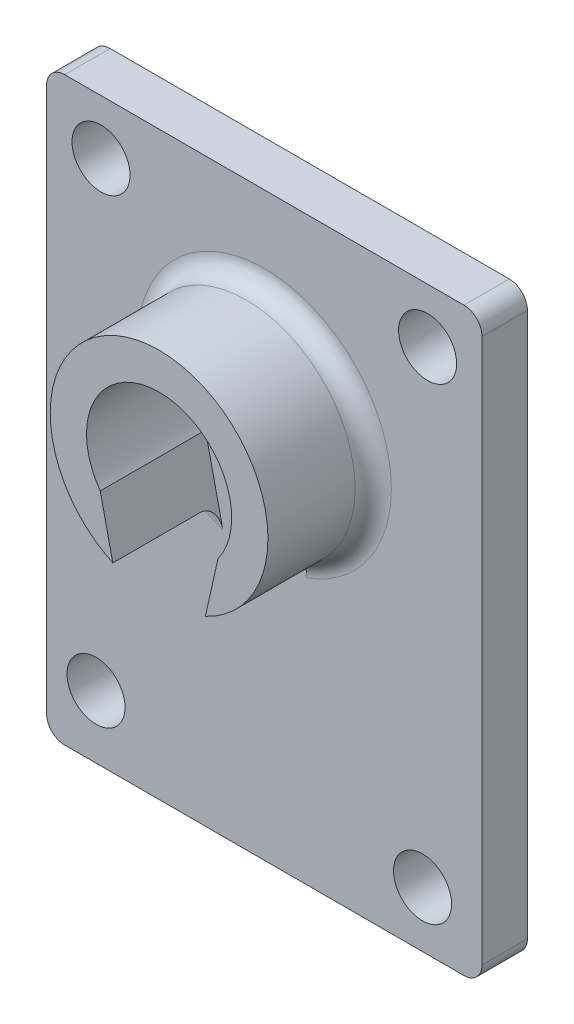
ISO-10303-21;
HEADER;
FILE_DESCRIPTION(('STEP AP214'),'2;1');
FILE_NAME('part.step','',(''),(''),'','','');
FILE_SCHEMA(('AUTOMOTIVE_DESIGN { 1 0 10303 214 1 1 1 1 }'));
ENDSEC;
DATA;
#1=APPLICATION_CONTEXT('core data for automotive mechanical design processes');
#2=APPLICATION_PROTOCOL_DEFINITION('international standard','automotive_design',2000,#1);
#3=PRODUCT_CONTEXT('',#1,'mechanical');
#4=PRODUCT('Part','Part','',(#3));
#5=PRODUCT_RELATED_PRODUCT_CATEGORY('part','',(#4));
#6=PRODUCT_DEFINITION_FORMATION('','',#4);
#7=PRODUCT_DEFINITION_CONTEXT('part definition',#1,'design');
#8=PRODUCT_DEFINITION('design','',#6,#7);
#9=PRODUCT_DEFINITION_SHAPE('','',#8);
#10=(LENGTH_UNIT() NAMED_UNIT(*) SI_UNIT(.MILLI.,.METRE.));
#11=(NAMED_UNIT(*) PLANE_ANGLE_UNIT() SI_UNIT($,.RADIAN.));
#12=(NAMED_UNIT(*) SI_UNIT($,.STERADIAN.) SOLID_ANGLE_UNIT());
#13=UNCERTAINTY_MEASURE_WITH_UNIT(LENGTH_MEASURE(1.E-05),#10,'distance_accuracy_value','');
#14=(GEOMETRIC_REPRESENTATION_CONTEXT(3) GLOBAL_UNCERTAINTY_ASSIGNED_CONTEXT((#13)) GLOBAL_UNIT_ASSIGNED_CONTEXT((#10,
#11,#12)) REPRESENTATION_CONTEXT('',''));
#15=CARTESIAN_POINT('',(0.,0.,0.));
#16=DIRECTION('',(0.,0.,1.));
#17=DIRECTION('',(1.,0.,0.));
#18=AXIS2_PLACEMENT_3D('',#15,#16,#17);
#19=CARTESIAN_POINT('',(10.5977749083218,0.272435897435896,8.3));
#20=DIRECTION('',(0.,0.,-1.));
#21=DIRECTION('',(-1.,0.,0.));
#22=AXIS2_PLACEMENT_3D('',#19,#20,#21);
#23=CYLINDRICAL_SURFACE('',#22,4.);
#24=CARTESIAN_POINT('',(10.5977749083218,0.272435897435896,8.3));
#25=DIRECTION('',(0.,0.,1.));
#26=DIRECTION('',(1.,0.,0.));
#27=AXIS2_PLACEMENT_3D('',#24,#25,#26);
#28=CIRCLE('',#27,4.);
#29=CARTESIAN_POINT('',(13.8414398693809,-2.06821307675854,8.3));
#30=VERTEX_POINT('',#29);
#31=CARTESIAN_POINT('',(7.35410994726267,-2.06821307675853,8.3));
#32=VERTEX_POINT('',#31);
#33=EDGE_CURVE('E150',#30,#32,#28,.T.);
#34=ORIENTED_EDGE('',*,*,#33,.T.);
#35=DIRECTION('',(0.,0.,1.));
#36=VECTOR('',#35,1.);
#37=CARTESIAN_POINT('',(7.35410994726267,-2.06821307675853,2.5));
#38=LINE('',#37,#36);
#39=CARTESIAN_POINT('',(7.35410994726267,-2.06821307675853,2.5));
#40=VERTEX_POINT('',#39);
#41=EDGE_CURVE('E134',#40,#32,#38,.T.);
#42=ORIENTED_EDGE('',*,*,#41,.F.);
#43=CARTESIAN_POINT('',(10.5977749083218,0.272435897435896,2.5));
#44=DIRECTION('',(0.,0.,1.));
#45=DIRECTION('',(1.,0.,0.));
#46=AXIS2_PLACEMENT_3D('',#43,#44,#45);
#47=CIRCLE('',#46,4.);
#48=CARTESIAN_POINT('',(13.8414398693809,-2.06821307675854,2.5));
#49=VERTEX_POINT('',#48);
#50=EDGE_CURVE('E148',#49,#40,#47,.T.);
#51=ORIENTED_EDGE('',*,*,#50,.F.);
#52=DIRECTION('',(0.,0.,1.));
#53=VECTOR('',#52,1.);
#54=CARTESIAN_POINT('',(13.8414398693809,-2.06821307675854,2.5));
#55=LINE('',#54,#53);
#56=EDGE_CURVE('E363',#49,#30,#55,.T.);
#57=ORIENTED_EDGE('',*,*,#56,.T.);
#58=EDGE_LOOP('',(#34,#42,#51,#57));
#59=FACE_BOUND('',#58,.T.);
#60=ADVANCED_FACE('F36',(#59),#23,.F.);
#61=CARTESIAN_POINT('',(0.,0.,8.3));
#62=DIRECTION('',(0.,0.,1.));
#63=DIRECTION('',(1.,0.,0.));
#64=AXIS2_PLACEMENT_3D('',#61,#62,#63);
#65=PLANE('',#64);
#66=CARTESIAN_POINT('',(10.5977749083218,0.272435897435896,8.3));
#67=DIRECTION('',(0.,0.,1.));
#68=DIRECTION('',(1.,0.,0.));
#69=AXIS2_PLACEMENT_3D('',#66,#67,#68);
#70=CIRCLE('',#69,6.);
#71=CARTESIAN_POINT('',(13.1477749083218,-5.1587241996336,8.3));
#72=VERTEX_POINT('',#71);
#73=CARTESIAN_POINT('',(8.04777490832179,-5.15872419963361,8.3));
#74=VERTEX_POINT('',#73);
#75=EDGE_CURVE('E157',#72,#74,#70,.T.);
#76=ORIENTED_EDGE('',*,*,#75,.T.);
#77=DIRECTION('',(-0.219001296975217,0.975724567653789,0.));
#78=VECTOR('',#77,1.);
#79=CARTESIAN_POINT('',(6.55944930315858,1.47226784325946,8.3));
#80=LINE('',#79,#78);
#81=EDGE_CURVE('E142',#74,#32,#80,.T.);
#82=ORIENTED_EDGE('',*,*,#81,.T.);
#83=ORIENTED_EDGE('',*,*,#33,.F.);
#84=DIRECTION('',(0.219001296975215,0.975724567653789,0.));
#85=VECTOR('',#84,1.);
#86=CARTESIAN_POINT('',(13.6195287080283,-3.05690207065453,8.3));
#87=LINE('',#86,#85);
#88=EDGE_CURVE('E361',#72,#30,#87,.T.);
#89=ORIENTED_EDGE('',*,*,#88,.F.);
#90=EDGE_LOOP('',(#76,#82,#83,#89));
#91=FACE_BOUND('',#90,.T.);
#92=ADVANCED_FACE('F242',(#91),#65,.T.);
#93=CARTESIAN_POINT('',(0.,0.,2.5));
#94=DIRECTION('',(0.,0.,1.));
#95=DIRECTION('',(1.,0.,0.));
#96=AXIS2_PLACEMENT_3D('',#93,#94,#95);
#97=PLANE('',#96);
#98=DIRECTION('',(-0.219001296975217,0.975724567653789,0.));
#99=VECTOR('',#98,1.);
#100=CARTESIAN_POINT('',(6.55944930315858,1.47226784325946,2.5));
#101=LINE('',#100,#99);
#102=CARTESIAN_POINT('',(8.313925423832,-6.34451442217477,2.5));
#103=VERTEX_POINT('',#102);
#104=EDGE_CURVE('E131',#103,#40,#101,.T.);
#105=ORIENTED_EDGE('',*,*,#104,.F.);
#106=CARTESIAN_POINT('',(10.5977749083218,0.272435897435896,2.5));
#107=DIRECTION('',(0.,0.,1.));
#108=DIRECTION('',(1.,0.,0.));
#109=AXIS2_PLACEMENT_3D('',#106,#107,#108);
#110=CIRCLE('',#109,7.);
#111=CARTESIAN_POINT('',(12.8816243928116,-6.34451442217477,2.5));
#112=VERTEX_POINT('',#111);
#113=EDGE_CURVE('E214',#103,#112,#110,.F.);
#114=ORIENTED_EDGE('',*,*,#113,.T.);
#115=DIRECTION('',(0.219001296975215,0.975724567653789,0.));
#116=VECTOR('',#115,1.);
#117=CARTESIAN_POINT('',(13.6195287080283,-3.05690207065453,2.5));
#118=LINE('',#117,#116);
#119=EDGE_CURVE('E155',#112,#49,#118,.T.);
#120=ORIENTED_EDGE('',*,*,#119,.T.);
#121=ORIENTED_EDGE('',*,*,#50,.T.);
#122=EDGE_LOOP('',(#105,#114,#120,#121));
#123=FACE_BOUND('',#122,.T.);
#124=CARTESIAN_POINT('',(19.318040385481,-17.909823822338,2.5));
#125=DIRECTION('',(0.,0.,1.));
#126=DIRECTION('',(1.,0.,0.));
#127=AXIS2_PLACEMENT_3D('',#124,#125,#126);
#128=CIRCLE('',#127,1.59999999999999);
#129=CARTESIAN_POINT('',(20.918040385481,-17.909823822338,2.5));
#130=VERTEX_POINT('',#129);
#131=EDGE_CURVE('E173',#130,#130,#128,.T.);
#132=ORIENTED_EDGE('',*,*,#131,.F.);
#133=EDGE_LOOP('',(#132));
#134=FACE_BOUND('',#133,.T.);
#135=CARTESIAN_POINT('',(1.59777490832179,8.02243589743589,2.5));
#136=DIRECTION('',(0.,0.,1.));
#137=DIRECTION('',(1.,0.,0.));
#138=AXIS2_PLACEMENT_3D('',#135,#136,#137);
#139=CIRCLE('',#138,1.6);
#140=CARTESIAN_POINT('',(3.19777490832179,8.02243589743589,2.5));
#141=VERTEX_POINT('',#140);
#142=EDGE_CURVE('E185',#141,#141,#139,.T.);
#143=ORIENTED_EDGE('',*,*,#142,.F.);
#144=EDGE_LOOP('',(#143));
#145=FACE_BOUND('',#144,.T.);
#146=DIRECTION('',(-1.,0.,0.));
#147=VECTOR('',#146,1.);
#148=CARTESIAN_POINT('',(-1.40222509167821,11.0224358974359,2.5));
#149=LINE('',#148,#147);
#150=CARTESIAN_POINT('',(21.5977749083218,11.0224358974359,2.5));
#151=VERTEX_POINT('',#150);
#152=CARTESIAN_POINT('',(-0.402225091678214,11.0224358974359,2.5));
#153=VERTEX_POINT('',#152);
#154=EDGE_CURVE('E199',#151,#153,#149,.T.);
#155=ORIENTED_EDGE('',*,*,#154,.T.);
#156=CARTESIAN_POINT('',(-0.402225091678214,10.0224358974359,2.5));
#157=DIRECTION('',(0.,0.,1.));
#158=DIRECTION('',(1.,0.,0.));
#159=AXIS2_PLACEMENT_3D('',#156,#157,#158);
#160=CIRCLE('',#159,1.);
#161=CARTESIAN_POINT('',(-1.40222509167821,10.0224358974359,2.5));
#162=VERTEX_POINT('',#161);
#163=EDGE_CURVE('E300',#153,#162,#160,.T.);
#164=ORIENTED_EDGE('',*,*,#163,.T.);
#165=DIRECTION('',(0.,-1.,0.));
#166=VECTOR('',#165,1.);
#167=CARTESIAN_POINT('',(-1.40222509167821,11.0224358974359,2.5));
#168=LINE('',#167,#166);
#169=CARTESIAN_POINT('',(-1.40222509167821,-19.9775641025641,2.5));
#170=VERTEX_POINT('',#169);
#171=EDGE_CURVE('E191',#162,#170,#168,.T.);
#172=ORIENTED_EDGE('',*,*,#171,.T.);
#173=CARTESIAN_POINT('',(-0.40222509167821,-19.9775641025641,2.5));
#174=DIRECTION('',(0.,0.,1.));
#175=DIRECTION('',(1.,0.,0.));
#176=AXIS2_PLACEMENT_3D('',#173,#174,#175);
#177=CIRCLE('',#176,1.);
#178=CARTESIAN_POINT('',(-0.40222509167821,-20.9775641025641,2.5));
#179=VERTEX_POINT('',#178);
#180=EDGE_CURVE('E319',#170,#179,#177,.T.);
#181=ORIENTED_EDGE('',*,*,#180,.T.);
#182=DIRECTION('',(1.,0.,0.));
#183=VECTOR('',#182,1.);
#184=CARTESIAN_POINT('',(-1.40222509167821,-20.9775641025641,2.5));
#185=LINE('',#184,#183);
#186=CARTESIAN_POINT('',(21.5977749083218,-20.9775641025641,2.5));
#187=VERTEX_POINT('',#186);
#188=EDGE_CURVE('E194',#179,#187,#185,.T.);
#189=ORIENTED_EDGE('',*,*,#188,.T.);
#190=CARTESIAN_POINT('',(21.5977749083218,-19.9775641025641,2.5));
#191=DIRECTION('',(0.,0.,1.));
#192=DIRECTION('',(1.,0.,0.));
#193=AXIS2_PLACEMENT_3D('',#190,#191,#192);
#194=CIRCLE('',#193,1.);
#195=CARTESIAN_POINT('',(22.5977749083218,-19.9775641025641,2.5));
#196=VERTEX_POINT('',#195);
#197=EDGE_CURVE('E57',#187,#196,#194,.T.);
#198=ORIENTED_EDGE('',*,*,#197,.T.);
#199=DIRECTION('',(0.,1.,0.));
#200=VECTOR('',#199,1.);
#201=CARTESIAN_POINT('',(22.5977749083218,11.0224358974359,2.5));
#202=LINE('',#201,#200);
#203=CARTESIAN_POINT('',(22.5977749083218,10.0224358974359,2.5));
#204=VERTEX_POINT('',#203);
#205=EDGE_CURVE('E197',#196,#204,#202,.T.);
#206=ORIENTED_EDGE('',*,*,#205,.T.);
#207=CARTESIAN_POINT('',(21.5977749083218,10.0224358974359,2.5));
#208=DIRECTION('',(0.,0.,1.));
#209=DIRECTION('',(1.,0.,0.));
#210=AXIS2_PLACEMENT_3D('',#207,#208,#209);
#211=CIRCLE('',#210,1.);
#212=EDGE_CURVE('E316',#204,#151,#211,.T.);
#213=ORIENTED_EDGE('',*,*,#212,.T.);
#214=EDGE_LOOP('',(#155,#164,#172,#181,#189,#198,#206,#213));
#215=FACE_BOUND('',#214,.T.);
#216=CARTESIAN_POINT('',(19.5977749083218,8.02243589743589,2.5));
#217=DIRECTION('',(0.,0.,1.));
#218=DIRECTION('',(-1.,0.,0.));
#219=AXIS2_PLACEMENT_3D('',#216,#217,#218);
#220=CIRCLE('',#219,1.6);
#221=CARTESIAN_POINT('',(17.9977749083218,8.02243589743589,2.5));
#222=VERTEX_POINT('',#221);
#223=EDGE_CURVE('E179',#222,#222,#220,.T.);
#224=ORIENTED_EDGE('',*,*,#223,.F.);
#225=EDGE_LOOP('',(#224));
#226=FACE_BOUND('',#225,.T.);
#227=CARTESIAN_POINT('',(1.32222893233219,-17.5215325106698,2.5));
#228=DIRECTION('',(0.,0.,1.));
#229=DIRECTION('',(-1.,0.,0.));
#230=AXIS2_PLACEMENT_3D('',#227,#228,#229);
#231=CIRCLE('',#230,1.6);
#232=CARTESIAN_POINT('',(-0.277771067667811,-17.5215325106698,2.5));
#233=VERTEX_POINT('',#232);
#234=EDGE_CURVE('E167',#233,#233,#231,.T.);
#235=ORIENTED_EDGE('',*,*,#234,.F.);
#236=EDGE_LOOP('',(#235));
#237=FACE_BOUND('',#236,.T.);
#238=ADVANCED_FACE('F153',(#123,#134,#145,#215,#226,#237),#97,.T.);
#239=CARTESIAN_POINT('',(0.,0.,0.));
#240=DIRECTION('',(0.,0.,1.));
#241=DIRECTION('',(1.,0.,0.));
#242=AXIS2_PLACEMENT_3D('',#239,#240,#241);
#243=PLANE('',#242);
#244=DIRECTION('',(0.,-1.,0.));
#245=VECTOR('',#244,1.);
#246=CARTESIAN_POINT('',(-1.40222509167821,11.0224358974359,0.));
#247=LINE('',#246,#245);
#248=CARTESIAN_POINT('',(-1.40222509167821,10.0224358974359,0.));
#249=VERTEX_POINT('',#248);
#250=CARTESIAN_POINT('',(-1.40222509167821,-19.9775641025641,0.));
#251=VERTEX_POINT('',#250);
#252=EDGE_CURVE('E188',#249,#251,#247,.T.);
#253=ORIENTED_EDGE('',*,*,#252,.F.);
#254=CARTESIAN_POINT('',(-0.402225091678214,10.0224358974359,0.));
#255=DIRECTION('',(0.,0.,1.));
#256=DIRECTION('',(1.,0.,0.));
#257=AXIS2_PLACEMENT_3D('',#254,#255,#256);
#258=CIRCLE('',#257,1.);
#259=CARTESIAN_POINT('',(-0.402225091678214,11.0224358974359,0.));
#260=VERTEX_POINT('',#259);
#261=EDGE_CURVE('E301',#249,#260,#258,.F.);
#262=ORIENTED_EDGE('',*,*,#261,.T.);
#263=DIRECTION('',(-1.,0.,0.));
#264=VECTOR('',#263,1.);
#265=CARTESIAN_POINT('',(-1.40222509167821,11.0224358974359,0.));
#266=LINE('',#265,#264);
#267=CARTESIAN_POINT('',(21.5977749083218,11.0224358974359,0.));
#268=VERTEX_POINT('',#267);
#269=EDGE_CURVE('E195',#268,#260,#266,.T.);
#270=ORIENTED_EDGE('',*,*,#269,.F.);
#271=CARTESIAN_POINT('',(21.5977749083218,10.0224358974359,0.));
#272=DIRECTION('',(0.,0.,1.));
#273=DIRECTION('',(1.,0.,0.));
#274=AXIS2_PLACEMENT_3D('',#271,#272,#273);
#275=CIRCLE('',#274,1.);
#276=CARTESIAN_POINT('',(22.5977749083218,10.0224358974359,0.));
#277=VERTEX_POINT('',#276);
#278=EDGE_CURVE('E302',#268,#277,#275,.F.);
#279=ORIENTED_EDGE('',*,*,#278,.T.);
#280=DIRECTION('',(0.,1.,0.));
#281=VECTOR('',#280,1.);
#282=CARTESIAN_POINT('',(22.5977749083218,11.0224358974359,0.));
#283=LINE('',#282,#281);
#284=CARTESIAN_POINT('',(22.5977749083218,-19.9775641025641,0.));
#285=VERTEX_POINT('',#284);
#286=EDGE_CURVE('E208',#285,#277,#283,.T.);
#287=ORIENTED_EDGE('',*,*,#286,.F.);
#288=CARTESIAN_POINT('',(21.5977749083218,-19.9775641025641,0.));
#289=DIRECTION('',(0.,0.,1.));
#290=DIRECTION('',(1.,0.,0.));
#291=AXIS2_PLACEMENT_3D('',#288,#289,#290);
#292=CIRCLE('',#291,1.);
#293=CARTESIAN_POINT('',(21.5977749083218,-20.9775641025641,0.));
#294=VERTEX_POINT('',#293);
#295=EDGE_CURVE('E304',#285,#294,#292,.F.);
#296=ORIENTED_EDGE('',*,*,#295,.T.);
#297=DIRECTION('',(1.,0.,0.));
#298=VECTOR('',#297,1.);
#299=CARTESIAN_POINT('',(-1.40222509167821,-20.9775641025641,0.));
#300=LINE('',#299,#298);
#301=CARTESIAN_POINT('',(-0.40222509167821,-20.9775641025641,0.));
#302=VERTEX_POINT('',#301);
#303=EDGE_CURVE('E205',#302,#294,#300,.T.);
#304=ORIENTED_EDGE('',*,*,#303,.F.);
#305=CARTESIAN_POINT('',(-0.40222509167821,-19.9775641025641,0.));
#306=DIRECTION('',(0.,0.,1.));
#307=DIRECTION('',(1.,0.,0.));
#308=AXIS2_PLACEMENT_3D('',#305,#306,#307);
#309=CIRCLE('',#308,1.);
#310=EDGE_CURVE('E308',#302,#251,#309,.F.);
#311=ORIENTED_EDGE('',*,*,#310,.T.);
#312=EDGE_LOOP('',(#253,#262,#270,#279,#287,#296,#304,#311));
#313=FACE_BOUND('',#312,.T.);
#314=CARTESIAN_POINT('',(1.59777490832179,8.02243589743589,0.));
#315=DIRECTION('',(0.,0.,1.));
#316=DIRECTION('',(1.,0.,0.));
#317=AXIS2_PLACEMENT_3D('',#314,#315,#316);
#318=CIRCLE('',#317,1.6);
#319=CARTESIAN_POINT('',(3.19777490832179,8.02243589743589,0.));
#320=VERTEX_POINT('',#319);
#321=EDGE_CURVE('E182',#320,#320,#318,.T.);
#322=ORIENTED_EDGE('',*,*,#321,.T.);
#323=EDGE_LOOP('',(#322));
#324=FACE_BOUND('',#323,.T.);
#325=CARTESIAN_POINT('',(19.5977749083218,8.02243589743589,0.));
#326=DIRECTION('',(0.,0.,1.));
#327=DIRECTION('',(-1.,0.,0.));
#328=AXIS2_PLACEMENT_3D('',#325,#326,#327);
#329=CIRCLE('',#328,1.6);
#330=CARTESIAN_POINT('',(17.9977749083218,8.02243589743589,0.));
#331=VERTEX_POINT('',#330);
#332=EDGE_CURVE('E176',#331,#331,#329,.T.);
#333=ORIENTED_EDGE('',*,*,#332,.T.);
#334=EDGE_LOOP('',(#333));
#335=FACE_BOUND('',#334,.T.);
#336=CARTESIAN_POINT('',(19.318040385481,-17.909823822338,0.));
#337=DIRECTION('',(0.,0.,1.));
#338=DIRECTION('',(1.,0.,0.));
#339=AXIS2_PLACEMENT_3D('',#336,#337,#338);
#340=CIRCLE('',#339,1.59999999999999);
#341=CARTESIAN_POINT('',(20.918040385481,-17.909823822338,0.));
#342=VERTEX_POINT('',#341);
#343=EDGE_CURVE('E170',#342,#342,#340,.T.);
#344=ORIENTED_EDGE('',*,*,#343,.T.);
#345=EDGE_LOOP('',(#344));
#346=FACE_BOUND('',#345,.T.);
#347=CARTESIAN_POINT('',(1.32222893233219,-17.5215325106698,0.));
#348=DIRECTION('',(0.,0.,1.));
#349=DIRECTION('',(-1.,0.,0.));
#350=AXIS2_PLACEMENT_3D('',#347,#348,#349);
#351=CIRCLE('',#350,1.6);
#352=CARTESIAN_POINT('',(-0.277771067667811,-17.5215325106698,0.));
#353=VERTEX_POINT('',#352);
#354=EDGE_CURVE('E166',#353,#353,#351,.T.);
#355=ORIENTED_EDGE('',*,*,#354,.T.);
#356=EDGE_LOOP('',(#355));
#357=FACE_BOUND('',#356,.T.);
#358=ADVANCED_FACE('F270',(#313,#324,#335,#346,#357),#243,.F.);
#359=CARTESIAN_POINT('',(-1.40222509167821,11.0224358974359,2.5));
#360=DIRECTION('',(1.,0.,0.));
#361=DIRECTION('',(0.,1.,0.));
#362=AXIS2_PLACEMENT_3D('',#359,#360,#361);
#363=PLANE('',#362);
#364=ORIENTED_EDGE('',*,*,#171,.F.);
#365=DIRECTION('',(0.,0.,-1.));
#366=VECTOR('',#365,1.);
#367=CARTESIAN_POINT('',(-1.40222509167821,10.0224358974359,2.5));
#368=LINE('',#367,#366);
#369=EDGE_CURVE('E291',#162,#249,#368,.T.);
#370=ORIENTED_EDGE('',*,*,#369,.T.);
#371=ORIENTED_EDGE('',*,*,#252,.T.);
#372=DIRECTION('',(0.,0.,-1.));
#373=VECTOR('',#372,1.);
#374=CARTESIAN_POINT('',(-1.40222509167821,-19.9775641025641,2.5));
#375=LINE('',#374,#373);
#376=EDGE_CURVE('E294',#251,#170,#375,.F.);
#377=ORIENTED_EDGE('',*,*,#376,.T.);
#378=EDGE_LOOP('',(#364,#370,#371,#377));
#379=FACE_BOUND('',#378,.T.);
#380=ADVANCED_FACE('F273',(#379),#363,.F.);
#381=CARTESIAN_POINT('',(-1.40222509167821,-20.9775641025641,2.5));
#382=DIRECTION('',(0.,1.,0.));
#383=DIRECTION('',(0.,0.,1.));
#384=AXIS2_PLACEMENT_3D('',#381,#382,#383);
#385=PLANE('',#384);
#386=ORIENTED_EDGE('',*,*,#188,.F.);
#387=DIRECTION('',(0.,0.,-1.));
#388=VECTOR('',#387,1.);
#389=CARTESIAN_POINT('',(-0.40222509167821,-20.9775641025641,2.5));
#390=LINE('',#389,#388);
#391=EDGE_CURVE('E324',#179,#302,#390,.T.);
#392=ORIENTED_EDGE('',*,*,#391,.T.);
#393=ORIENTED_EDGE('',*,*,#303,.T.);
#394=DIRECTION('',(0.,0.,-1.));
#395=VECTOR('',#394,1.);
#396=CARTESIAN_POINT('',(21.5977749083218,-20.9775641025641,2.5));
#397=LINE('',#396,#395);
#398=EDGE_CURVE('E322',#294,#187,#397,.F.);
#399=ORIENTED_EDGE('',*,*,#398,.T.);
#400=EDGE_LOOP('',(#386,#392,#393,#399));
#401=FACE_BOUND('',#400,.T.);
#402=ADVANCED_FACE('F281',(#401),#385,.F.);
#403=CARTESIAN_POINT('',(22.5977749083218,11.0224358974359,2.5));
#404=DIRECTION('',(-1.,0.,0.));
#405=DIRECTION('',(0.,-1.,0.));
#406=AXIS2_PLACEMENT_3D('',#403,#404,#405);
#407=PLANE('',#406);
#408=ORIENTED_EDGE('',*,*,#205,.F.);
#409=DIRECTION('',(0.,0.,-1.));
#410=VECTOR('',#409,1.);
#411=CARTESIAN_POINT('',(22.5977749083218,-19.9775641025641,2.5));
#412=LINE('',#411,#410);
#413=EDGE_CURVE('E11',#196,#285,#412,.T.);
#414=ORIENTED_EDGE('',*,*,#413,.T.);
#415=ORIENTED_EDGE('',*,*,#286,.T.);
#416=DIRECTION('',(0.,0.,-1.));
#417=VECTOR('',#416,1.);
#418=CARTESIAN_POINT('',(22.5977749083218,10.0224358974359,2.5));
#419=LINE('',#418,#417);
#420=EDGE_CURVE('E44',#277,#204,#419,.F.);
#421=ORIENTED_EDGE('',*,*,#420,.T.);
#422=EDGE_LOOP('',(#408,#414,#415,#421));
#423=FACE_BOUND('',#422,.T.);
#424=ADVANCED_FACE('F277',(#423),#407,.F.);
#425=CARTESIAN_POINT('',(-1.40222509167821,11.0224358974359,2.5));
#426=DIRECTION('',(0.,-1.,0.));
#427=DIRECTION('',(0.,0.,-1.));
#428=AXIS2_PLACEMENT_3D('',#425,#426,#427);
#429=PLANE('',#428);
#430=ORIENTED_EDGE('',*,*,#269,.T.);
#431=DIRECTION('',(0.,0.,-1.));
#432=VECTOR('',#431,1.);
#433=CARTESIAN_POINT('',(-0.402225091678214,11.0224358974359,2.5));
#434=LINE('',#433,#432);
#435=EDGE_CURVE('E314',#260,#153,#434,.F.);
#436=ORIENTED_EDGE('',*,*,#435,.T.);
#437=ORIENTED_EDGE('',*,*,#154,.F.);
#438=DIRECTION('',(0.,0.,-1.));
#439=VECTOR('',#438,1.);
#440=CARTESIAN_POINT('',(21.5977749083218,11.0224358974359,2.5));
#441=LINE('',#440,#439);
#442=EDGE_CURVE('E311',#151,#268,#441,.T.);
#443=ORIENTED_EDGE('',*,*,#442,.T.);
#444=EDGE_LOOP('',(#430,#436,#437,#443));
#445=FACE_BOUND('',#444,.T.);
#446=ADVANCED_FACE('F266',(#445),#429,.F.);
#447=CARTESIAN_POINT('',(1.59777490832179,8.02243589743589,2.5));
#448=DIRECTION('',(0.,0.,-1.));
#449=DIRECTION('',(-1.,0.,0.));
#450=AXIS2_PLACEMENT_3D('',#447,#448,#449);
#451=CYLINDRICAL_SURFACE('',#450,1.6);
#452=ORIENTED_EDGE('',*,*,#142,.T.);
#453=EDGE_LOOP('',(#452));
#454=FACE_BOUND('',#453,.T.);
#455=ORIENTED_EDGE('',*,*,#321,.F.);
#456=EDGE_LOOP('',(#455));
#457=FACE_BOUND('',#456,.T.);
#458=ADVANCED_FACE('F262',(#454,#457),#451,.F.);
#459=CARTESIAN_POINT('',(19.5977749083218,8.02243589743589,2.5));
#460=DIRECTION('',(0.,0.,-1.));
#461=DIRECTION('',(-1.,0.,0.));
#462=AXIS2_PLACEMENT_3D('',#459,#460,#461);
#463=CYLINDRICAL_SURFACE('',#462,1.6);
#464=ORIENTED_EDGE('',*,*,#223,.T.);
#465=EDGE_LOOP('',(#464));
#466=FACE_BOUND('',#465,.T.);
#467=ORIENTED_EDGE('',*,*,#332,.F.);
#468=EDGE_LOOP('',(#467));
#469=FACE_BOUND('',#468,.T.);
#470=ADVANCED_FACE('F258',(#466,#469),#463,.F.);
#471=CARTESIAN_POINT('',(19.318040385481,-17.909823822338,2.5));
#472=DIRECTION('',(0.,0.,-1.));
#473=DIRECTION('',(-1.,0.,0.));
#474=AXIS2_PLACEMENT_3D('',#471,#472,#473);
#475=CYLINDRICAL_SURFACE('',#474,1.59999999999999);
#476=ORIENTED_EDGE('',*,*,#131,.T.);
#477=EDGE_LOOP('',(#476));
#478=FACE_BOUND('',#477,.T.);
#479=ORIENTED_EDGE('',*,*,#343,.F.);
#480=EDGE_LOOP('',(#479));
#481=FACE_BOUND('',#480,.T.);
#482=ADVANCED_FACE('F254',(#478,#481),#475,.F.);
#483=CARTESIAN_POINT('',(1.32222893233219,-17.5215325106698,2.5));
#484=DIRECTION('',(0.,0.,-1.));
#485=DIRECTION('',(-1.,0.,0.));
#486=AXIS2_PLACEMENT_3D('',#483,#484,#485);
#487=CYLINDRICAL_SURFACE('',#486,1.6);
#488=ORIENTED_EDGE('',*,*,#234,.T.);
#489=EDGE_LOOP('',(#488));
#490=FACE_BOUND('',#489,.T.);
#491=ORIENTED_EDGE('',*,*,#354,.F.);
#492=EDGE_LOOP('',(#491));
#493=FACE_BOUND('',#492,.T.);
#494=ADVANCED_FACE('F248',(#490,#493),#487,.F.);
#495=CARTESIAN_POINT('',(10.5977749083218,0.272435897435896,8.3));
#496=DIRECTION('',(0.,0.,-1.));
#497=DIRECTION('',(-1.,0.,0.));
#498=AXIS2_PLACEMENT_3D('',#495,#496,#497);
#499=CYLINDRICAL_SURFACE('',#498,6.);
#500=DIRECTION('',(0.,0.,-1.));
#501=VECTOR('',#500,1.);
#502=CARTESIAN_POINT('',(13.1477749083218,-5.1587241996336,8.3));
#503=LINE('',#502,#501);
#504=CARTESIAN_POINT('',(13.1477749083218,-5.1587241996336,3.5));
#505=VERTEX_POINT('',#504);
#506=EDGE_CURVE('E163',#72,#505,#503,.T.);
#507=ORIENTED_EDGE('',*,*,#506,.T.);
#508=CARTESIAN_POINT('',(10.5977749083218,0.272435897435896,3.5));
#509=DIRECTION('',(0.,0.,1.));
#510=DIRECTION('',(1.,0.,0.));
#511=AXIS2_PLACEMENT_3D('',#508,#509,#510);
#512=CIRCLE('',#511,6.);
#513=CARTESIAN_POINT('',(8.04777490832179,-5.15872419963361,3.5));
#514=VERTEX_POINT('',#513);
#515=EDGE_CURVE('E202',#505,#514,#512,.T.);
#516=ORIENTED_EDGE('',*,*,#515,.T.);
#517=DIRECTION('',(0.,0.,-1.));
#518=VECTOR('',#517,1.);
#519=CARTESIAN_POINT('',(8.04777490832179,-5.15872419963361,8.3));
#520=LINE('',#519,#518);
#521=EDGE_CURVE('E161',#74,#514,#520,.T.);
#522=ORIENTED_EDGE('',*,*,#521,.F.);
#523=ORIENTED_EDGE('',*,*,#75,.F.);
#524=EDGE_LOOP('',(#507,#516,#522,#523));
#525=FACE_BOUND('',#524,.T.);
#526=ADVANCED_FACE('F240',(#525),#499,.T.);
#527=CARTESIAN_POINT('',(13.6195287080283,-3.05690207065453,2.5));
#528=DIRECTION('',(0.975724567653789,-0.219001296975215,0.));
#529=DIRECTION('',(0.219001296975215,0.975724567653789,0.));
#530=AXIS2_PLACEMENT_3D('',#527,#528,#529);
#531=PLANE('',#530);
#532=ORIENTED_EDGE('',*,*,#88,.T.);
#533=ORIENTED_EDGE('',*,*,#56,.F.);
#534=ORIENTED_EDGE('',*,*,#119,.F.);
#535=CARTESIAN_POINT('',(12.8816243928116,-6.34451442217477,2.5));
#536=CARTESIAN_POINT('',(12.9002262868818,-6.26163671642619,2.50001948932709));
#537=CARTESIAN_POINT('',(12.9188329418219,-6.17873779939892,2.5078396733726));
#538=CARTESIAN_POINT('',(12.9555463228002,-6.01516731704569,2.53874591670306));
#539=CARTESIAN_POINT('',(12.9736492573951,-5.93451264387785,2.56192583852366));
#540=CARTESIAN_POINT('',(13.0072353101593,-5.78487546243136,2.62081157887215));
#541=CARTESIAN_POINT('',(13.0228126073185,-5.71547335502007,2.65539712994933));
#542=CARTESIAN_POINT('',(13.0522875046649,-5.58415275615948,2.73697688900033));
#543=CARTESIAN_POINT('',(13.0661905197177,-5.52221013965979,2.78392943906649));
#544=CARTESIAN_POINT('',(13.0879280685525,-5.42536203541747,2.874527164605));
#545=CARTESIAN_POINT('',(13.0963559106069,-5.38781315941358,2.91521527429741));
#546=CARTESIAN_POINT('',(13.1116649356052,-5.31960629487032,3.00234861179626));
#547=CARTESIAN_POINT('',(13.1185461125698,-5.28894833297009,3.04879386185778));
#548=CARTESIAN_POINT('',(13.1304237689675,-5.23602937169678,3.14712551160069));
#549=CARTESIAN_POINT('',(13.135400707703,-5.21385543271562,3.19906169075793));
#550=CARTESIAN_POINT('',(13.1429614327876,-5.18016985497599,3.30639314787598));
#551=CARTESIAN_POINT('',(13.1455529521186,-5.16862376317806,3.36177662263624));
#552=CARTESIAN_POINT('',(13.147147728607,-5.16151849658283,3.43135162201381));
#553=CARTESIAN_POINT('',(13.1473828452403,-5.1604709727621,3.44506688551349));
#554=CARTESIAN_POINT('',(13.1476961588752,-5.1590750549517,3.4725191444722));
#555=CARTESIAN_POINT('',(13.1477745337496,-5.15872586847887,3.48625609757281));
#556=CARTESIAN_POINT('',(13.1477749083218,-5.15872419963361,3.5));
#557=B_SPLINE_CURVE_WITH_KNOTS('',3,(#535,#536,#537,#538,#539,#540,#541,#542,#543,#544,#545,
#546,#547,#548,#549,#550,#551,#552,#553,#554,#555,#556),.UNSPECIFIED.,.F.,.F.,(4,2,2,2,2,2,2,2,
2,2,4),(0.,0.254527033616344,0.510623992157437,0.746710160251138,0.982011028791614,
1.14939518609943,1.3167799904756,1.48583910677785,1.65434822199224,1.69560826842792,
1.73682146574745),.UNSPECIFIED.);
#558=EDGE_CURVE('E223',#112,#505,#557,.T.);
#559=ORIENTED_EDGE('',*,*,#558,.T.);
#560=ORIENTED_EDGE('',*,*,#506,.F.);
#561=EDGE_LOOP('',(#532,#533,#534,#559,#560));
#562=FACE_BOUND('',#561,.T.);
#563=ADVANCED_FACE('F236',(#562),#531,.F.);
#564=CARTESIAN_POINT('',(6.55944930315858,1.47226784325946,2.5));
#565=DIRECTION('',(0.975724567653788,0.219001296975217,0.));
#566=DIRECTION('',(-0.219001296975217,0.975724567653789,0.));
#567=AXIS2_PLACEMENT_3D('',#564,#565,#566);
#568=PLANE('',#567);
#569=ORIENTED_EDGE('',*,*,#81,.F.);
#570=ORIENTED_EDGE('',*,*,#521,.T.);
#571=CARTESIAN_POINT('',(8.04777490832179,-5.15872419963361,3.5));
#572=CARTESIAN_POINT('',(8.04777412955031,-5.15872072994427,3.47580985799282));
#573=CARTESIAN_POINT('',(8.04801839267963,-5.15980900448669,3.45163362849573));
#574=CARTESIAN_POINT('',(8.04898737550767,-5.16412614947173,3.40349706241975));
#575=CARTESIAN_POINT('',(8.04971180537339,-5.16735372861075,3.37953660443691));
#576=CARTESIAN_POINT('',(8.05257702566936,-5.18011925042787,3.30857209328996));
#577=CARTESIAN_POINT('',(8.0554100707048,-5.19274142061832,3.26211844077616));
#578=CARTESIAN_POINT('',(8.06272989472891,-5.22535370296488,3.17218948344341));
#579=CARTESIAN_POINT('',(8.0672132527731,-5.24532857366077,3.12870823662691));
#580=CARTESIAN_POINT('',(8.07759530246078,-5.29158410311552,3.04536892087136));
#581=CARTESIAN_POINT('',(8.08349624461025,-5.31787478863687,3.00551675348015));
#582=CARTESIAN_POINT('',(8.09700795258074,-5.37807400023908,2.92683150358043));
#583=CARTESIAN_POINT('',(8.10472080352073,-5.41243734992121,2.8883662642482));
#584=CARTESIAN_POINT('',(8.1212310844636,-5.48599621444543,2.81668886261636));
#585=CARTESIAN_POINT('',(8.13002872062933,-5.52519264781246,2.78347770159802));
#586=CARTESIAN_POINT('',(8.15034810722775,-5.61572236146059,2.71624893796363));
#587=CARTESIAN_POINT('',(8.16206057694076,-5.66790536039586,2.68343224071289));
#588=CARTESIAN_POINT('',(8.18639265317705,-5.7763129584041,2.62569641748847));
#589=CARTESIAN_POINT('',(8.19901341739217,-5.83254271538426,2.60078759750116));
#590=CARTESIAN_POINT('',(8.2282917860457,-5.9629877127,2.55350387833816));
#591=CARTESIAN_POINT('',(8.24513697749215,-6.0380387163614,2.53352513811188));
#592=CARTESIAN_POINT('',(8.27929910638173,-6.19024251104801,2.50678750009517));
#593=CARTESIAN_POINT('',(8.29661535139529,-6.26739221706619,2.50001015985028));
#594=CARTESIAN_POINT('',(8.313925423832,-6.34451442217477,2.5));
#595=B_SPLINE_CURVE_WITH_KNOTS('',3,(#571,#572,#573,#574,#575,#576,#577,#578,#579,#580,#581,
#582,#583,#584,#585,#586,#587,#588,#589,#590,#591,#592,#593,#594),.UNSPECIFIED.,.F.,.F.,(4,2,2,
2,2,2,2,2,2,2,2,4),(0.,0.0725181687012756,0.144992604593764,0.288858279243841,0.432427397948468,
0.576225965890642,0.73212304501939,0.888049798102446,1.07558061843237,1.2633548455252,
1.50059553503574,1.73750455915604),.UNSPECIFIED.);
#596=EDGE_CURVE('E137',#514,#103,#595,.T.);
#597=ORIENTED_EDGE('',*,*,#596,.T.);
#598=ORIENTED_EDGE('',*,*,#104,.T.);
#599=ORIENTED_EDGE('',*,*,#41,.T.);
#600=EDGE_LOOP('',(#569,#570,#597,#598,#599));
#601=FACE_BOUND('',#600,.T.);
#602=ADVANCED_FACE('F133',(#601),#568,.T.);
#603=CARTESIAN_POINT('',(10.5977749083218,0.272435897435896,3.5));
#604=DIRECTION('',(0.,0.,1.));
#605=DIRECTION('',(1.,0.,0.));
#606=AXIS2_PLACEMENT_3D('',#603,#604,#605);
#607=TOROIDAL_SURFACE('',#606,7.,1.);
#608=ORIENTED_EDGE('',*,*,#558,.F.);
#609=ORIENTED_EDGE('',*,*,#113,.F.);
#610=ORIENTED_EDGE('',*,*,#596,.F.);
#611=ORIENTED_EDGE('',*,*,#515,.F.);
#612=EDGE_LOOP('',(#608,#609,#610,#611));
#613=FACE_BOUND('',#612,.T.);
#614=ADVANCED_FACE('F230',(#613),#607,.F.);
#615=CARTESIAN_POINT('',(-0.402225091678214,10.0224358974359,2.5));
#616=DIRECTION('',(0.,0.,-1.));
#617=DIRECTION('',(-1.,0.,0.));
#618=AXIS2_PLACEMENT_3D('',#615,#616,#617);
#619=CYLINDRICAL_SURFACE('',#618,1.);
#620=ORIENTED_EDGE('',*,*,#163,.F.);
#621=ORIENTED_EDGE('',*,*,#435,.F.);
#622=ORIENTED_EDGE('',*,*,#261,.F.);
#623=ORIENTED_EDGE('',*,*,#369,.F.);
#624=EDGE_LOOP('',(#620,#621,#622,#623));
#625=FACE_BOUND('',#624,.T.);
#626=ADVANCED_FACE('F298',(#625),#619,.T.);
#627=CARTESIAN_POINT('',(-0.40222509167821,-19.9775641025641,2.5));
#628=DIRECTION('',(0.,0.,-1.));
#629=DIRECTION('',(-1.,0.,0.));
#630=AXIS2_PLACEMENT_3D('',#627,#628,#629);
#631=CYLINDRICAL_SURFACE('',#630,1.);
#632=ORIENTED_EDGE('',*,*,#180,.F.);
#633=ORIENTED_EDGE('',*,*,#376,.F.);
#634=ORIENTED_EDGE('',*,*,#310,.F.);
#635=ORIENTED_EDGE('',*,*,#391,.F.);
#636=EDGE_LOOP('',(#632,#633,#634,#635));
#637=FACE_BOUND('',#636,.T.);
#638=ADVANCED_FACE('F342',(#637),#631,.T.);
#639=CARTESIAN_POINT('',(21.5977749083218,-19.9775641025641,2.5));
#640=DIRECTION('',(0.,0.,-1.));
#641=DIRECTION('',(-1.,0.,0.));
#642=AXIS2_PLACEMENT_3D('',#639,#640,#641);
#643=CYLINDRICAL_SURFACE('',#642,1.);
#644=ORIENTED_EDGE('',*,*,#197,.F.);
#645=ORIENTED_EDGE('',*,*,#398,.F.);
#646=ORIENTED_EDGE('',*,*,#295,.F.);
#647=ORIENTED_EDGE('',*,*,#413,.F.);
#648=EDGE_LOOP('',(#644,#645,#646,#647));
#649=FACE_BOUND('',#648,.T.);
#650=ADVANCED_FACE('F335',(#649),#643,.T.);
#651=CARTESIAN_POINT('',(21.5977749083218,10.0224358974359,2.5));
#652=DIRECTION('',(0.,0.,-1.));
#653=DIRECTION('',(-1.,0.,0.));
#654=AXIS2_PLACEMENT_3D('',#651,#652,#653);
#655=CYLINDRICAL_SURFACE('',#654,1.);
#656=ORIENTED_EDGE('',*,*,#212,.F.);
#657=ORIENTED_EDGE('',*,*,#420,.F.);
#658=ORIENTED_EDGE('',*,*,#278,.F.);
#659=ORIENTED_EDGE('',*,*,#442,.F.);
#660=EDGE_LOOP('',(#656,#657,#658,#659));
#661=FACE_BOUND('',#660,.T.);
#662=ADVANCED_FACE('F38',(#661),#655,.T.);
#663=CLOSED_SHELL('',(#60,#92,#238,#358,#380,#402,#424,#446,#458,#470,#482,#494,#526,#563,#602,
#614,#626,#638,#650,#662));
#664=MANIFOLD_SOLID_BREP('B2',#663);
#665=ADVANCED_BREP_SHAPE_REPRESENTATION('',(#18,#664),#14);
#666=SHAPE_DEFINITION_REPRESENTATION(#9,#665);
ENDSEC;
END-ISO-10303-21;
